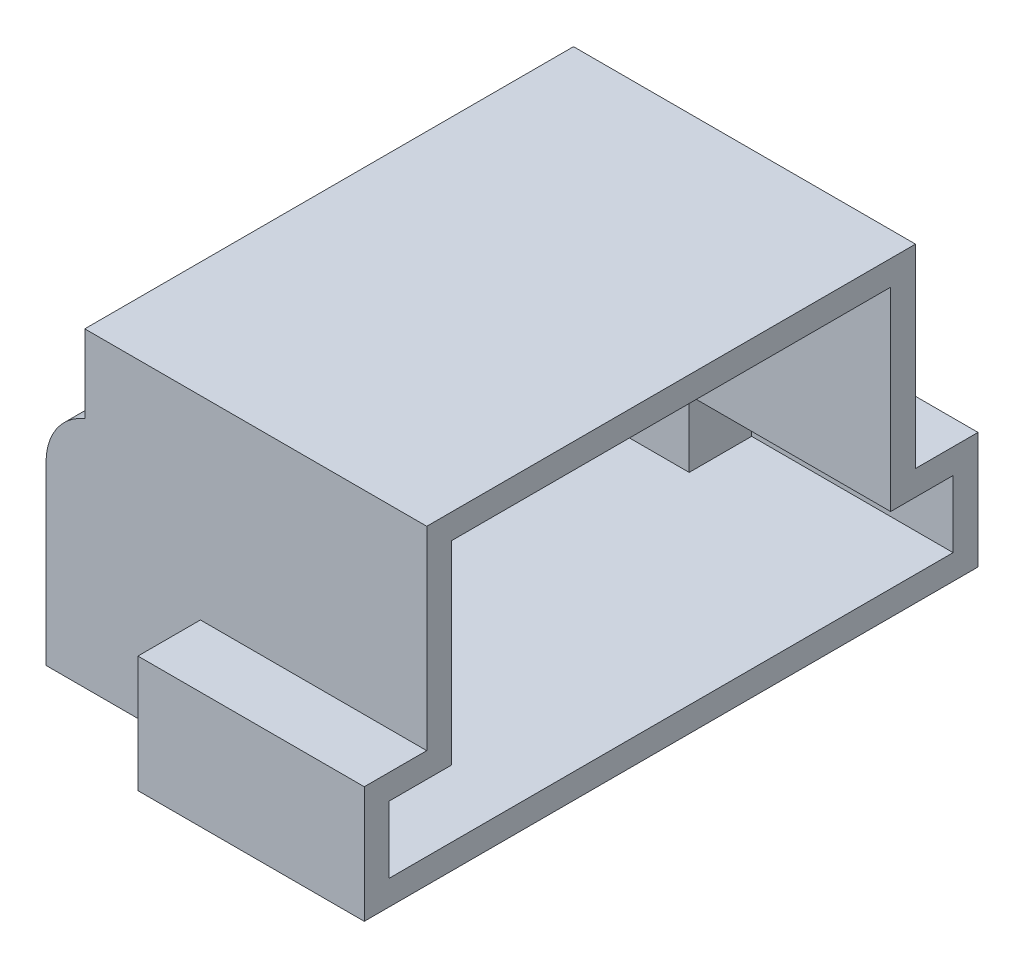
ISO-10303-21;
HEADER;
FILE_DESCRIPTION(('STEP AP214'),'2;1');
FILE_NAME('part.step','',(''),(''),'','','');
FILE_SCHEMA(('AUTOMOTIVE_DESIGN { 1 0 10303 214 1 1 1 1 }'));
ENDSEC;
DATA;
#1=APPLICATION_CONTEXT('core data for automotive mechanical design processes');
#2=APPLICATION_PROTOCOL_DEFINITION('international standard','automotive_design',2000,#1);
#3=PRODUCT_CONTEXT('',#1,'mechanical');
#4=PRODUCT('Part','Part','',(#3));
#5=PRODUCT_RELATED_PRODUCT_CATEGORY('part','',(#4));
#6=PRODUCT_DEFINITION_FORMATION('','',#4);
#7=PRODUCT_DEFINITION_CONTEXT('part definition',#1,'design');
#8=PRODUCT_DEFINITION('design','',#6,#7);
#9=PRODUCT_DEFINITION_SHAPE('','',#8);
#10=(LENGTH_UNIT() NAMED_UNIT(*) SI_UNIT(.MILLI.,.METRE.));
#11=(NAMED_UNIT(*) PLANE_ANGLE_UNIT() SI_UNIT($,.RADIAN.));
#12=(NAMED_UNIT(*) SI_UNIT($,.STERADIAN.) SOLID_ANGLE_UNIT());
#13=UNCERTAINTY_MEASURE_WITH_UNIT(LENGTH_MEASURE(1.E-05),#10,'distance_accuracy_value','');
#14=(GEOMETRIC_REPRESENTATION_CONTEXT(3) GLOBAL_UNCERTAINTY_ASSIGNED_CONTEXT((#13)) GLOBAL_UNIT_ASSIGNED_CONTEXT((#10,
#11,#12)) REPRESENTATION_CONTEXT('',''));
#15=CARTESIAN_POINT('',(0.,0.,0.));
#16=DIRECTION('',(0.,0.,1.));
#17=DIRECTION('',(1.,0.,0.));
#18=AXIS2_PLACEMENT_3D('',#15,#16,#17);
#19=CARTESIAN_POINT('',(4.6228,2.38125,0.));
#20=DIRECTION('',(-1.,0.,0.));
#21=DIRECTION('',(0.,0.,1.));
#22=AXIS2_PLACEMENT_3D('',#19,#20,#21);
#23=PLANE('',#22);
#24=DIRECTION('',(0.,0.,-1.));
#25=VECTOR('',#24,1.);
#26=CARTESIAN_POINT('',(4.6228,0.,0.));
#27=LINE('',#26,#25);
#28=CARTESIAN_POINT('',(4.6228,0.,0.));
#29=VERTEX_POINT('',#28);
#30=CARTESIAN_POINT('',(4.6228,0.,-12.5349));
#31=VERTEX_POINT('',#30);
#32=EDGE_CURVE('E428',#29,#31,#27,.T.);
#33=ORIENTED_EDGE('',*,*,#32,.T.);
#34=DIRECTION('',(0.,-1.,0.));
#35=VECTOR('',#34,1.);
#36=CARTESIAN_POINT('',(4.6228,2.38125,-12.5349));
#37=LINE('',#36,#35);
#38=CARTESIAN_POINT('',(4.6228,2.38125,-12.5349));
#39=VERTEX_POINT('',#38);
#40=EDGE_CURVE('E437',#39,#31,#37,.T.);
#41=ORIENTED_EDGE('',*,*,#40,.F.);
#42=DIRECTION('',(0.,0.,-1.));
#43=VECTOR('',#42,1.);
#44=CARTESIAN_POINT('',(4.6228,2.38125,0.));
#45=LINE('',#44,#43);
#46=CARTESIAN_POINT('',(4.6228,2.38125,-11.25855));
#47=VERTEX_POINT('',#46);
#48=EDGE_CURVE('E412',#47,#39,#45,.T.);
#49=ORIENTED_EDGE('',*,*,#48,.F.);
#50=DIRECTION('',(0.,-1.,0.));
#51=VECTOR('',#50,1.);
#52=CARTESIAN_POINT('',(4.6228,6.35,-11.25855));
#53=LINE('',#52,#51);
#54=CARTESIAN_POINT('',(4.6228,6.35,-11.25855));
#55=VERTEX_POINT('',#54);
#56=EDGE_CURVE('E373',#55,#47,#53,.T.);
#57=ORIENTED_EDGE('',*,*,#56,.F.);
#58=DIRECTION('',(0.,0.,1.));
#59=VECTOR('',#58,1.);
#60=CARTESIAN_POINT('',(4.6228,6.35,-6.26745));
#61=LINE('',#60,#59);
#62=CARTESIAN_POINT('',(4.6228,6.35,-1.27635));
#63=VERTEX_POINT('',#62);
#64=EDGE_CURVE('E345',#55,#63,#61,.T.);
#65=ORIENTED_EDGE('',*,*,#64,.T.);
#66=DIRECTION('',(0.,-1.,0.));
#67=VECTOR('',#66,1.);
#68=CARTESIAN_POINT('',(4.6228,6.35,-1.27635));
#69=LINE('',#68,#67);
#70=CARTESIAN_POINT('',(4.6228,2.38125,-1.27635));
#71=VERTEX_POINT('',#70);
#72=EDGE_CURVE('E362',#63,#71,#69,.T.);
#73=ORIENTED_EDGE('',*,*,#72,.T.);
#74=CARTESIAN_POINT('',(4.6228,2.38125,0.));
#75=VERTEX_POINT('',#74);
#76=EDGE_CURVE('E413',#75,#71,#45,.T.);
#77=ORIENTED_EDGE('',*,*,#76,.F.);
#78=DIRECTION('',(0.,-1.,0.));
#79=VECTOR('',#78,1.);
#80=CARTESIAN_POINT('',(4.6228,2.38125,0.));
#81=LINE('',#80,#79);
#82=EDGE_CURVE('E441',#75,#29,#81,.T.);
#83=ORIENTED_EDGE('',*,*,#82,.T.);
#84=EDGE_LOOP('',(#33,#41,#49,#57,#65,#73,#77,#83));
#85=FACE_BOUND('',#84,.T.);
#86=DIRECTION('',(0.,0.,-1.));
#87=VECTOR('',#86,1.);
#88=CARTESIAN_POINT('',(4.6228,0.508,0.));
#89=LINE('',#88,#87);
#90=CARTESIAN_POINT('',(4.6228,0.508,-0.508));
#91=VERTEX_POINT('',#90);
#92=CARTESIAN_POINT('',(4.6228,0.508,-12.0269));
#93=VERTEX_POINT('',#92);
#94=EDGE_CURVE('E278',#91,#93,#89,.T.);
#95=ORIENTED_EDGE('',*,*,#94,.F.);
#96=DIRECTION('',(0.,-1.,0.));
#97=VECTOR('',#96,1.);
#98=CARTESIAN_POINT('',(4.6228,2.38125,-0.508));
#99=LINE('',#98,#97);
#100=CARTESIAN_POINT('',(4.6228,1.87325,-0.508));
#101=VERTEX_POINT('',#100);
#102=EDGE_CURVE('E273',#101,#91,#99,.T.);
#103=ORIENTED_EDGE('',*,*,#102,.F.);
#104=DIRECTION('',(0.,0.,-1.));
#105=VECTOR('',#104,1.);
#106=CARTESIAN_POINT('',(4.6228,1.87325,0.));
#107=LINE('',#106,#105);
#108=CARTESIAN_POINT('',(4.6228,1.87325,-1.78435));
#109=VERTEX_POINT('',#108);
#110=EDGE_CURVE('E59',#101,#109,#107,.T.);
#111=ORIENTED_EDGE('',*,*,#110,.T.);
#112=DIRECTION('',(0.,-1.,0.));
#113=VECTOR('',#112,1.);
#114=CARTESIAN_POINT('',(4.6228,6.35,-1.78435));
#115=LINE('',#114,#113);
#116=CARTESIAN_POINT('',(4.6228,5.842,-1.78435));
#117=VERTEX_POINT('',#116);
#118=EDGE_CURVE('E231',#117,#109,#115,.T.);
#119=ORIENTED_EDGE('',*,*,#118,.F.);
#120=DIRECTION('',(0.,0.,1.));
#121=VECTOR('',#120,1.);
#122=CARTESIAN_POINT('',(4.6228,5.842,0.));
#123=LINE('',#122,#121);
#124=CARTESIAN_POINT('',(4.6228,5.842,-10.75055));
#125=VERTEX_POINT('',#124);
#126=EDGE_CURVE('E244',#125,#117,#123,.T.);
#127=ORIENTED_EDGE('',*,*,#126,.F.);
#128=DIRECTION('',(0.,-1.,0.));
#129=VECTOR('',#128,1.);
#130=CARTESIAN_POINT('',(4.6228,2.38125,-10.75055));
#131=LINE('',#130,#129);
#132=CARTESIAN_POINT('',(4.6228,1.87325,-10.75055));
#133=VERTEX_POINT('',#132);
#134=EDGE_CURVE('E262',#125,#133,#131,.T.);
#135=ORIENTED_EDGE('',*,*,#134,.T.);
#136=DIRECTION('',(0.,0.,-1.));
#137=VECTOR('',#136,1.);
#138=CARTESIAN_POINT('',(4.6228,1.87325,0.));
#139=LINE('',#138,#137);
#140=CARTESIAN_POINT('',(4.6228,1.87325,-12.0269));
#141=VERTEX_POINT('',#140);
#142=EDGE_CURVE('E277',#133,#141,#139,.T.);
#143=ORIENTED_EDGE('',*,*,#142,.T.);
#144=DIRECTION('',(0.,-1.,0.));
#145=VECTOR('',#144,1.);
#146=CARTESIAN_POINT('',(4.6228,2.38125,-12.0269));
#147=LINE('',#146,#145);
#148=EDGE_CURVE('E282',#141,#93,#147,.T.);
#149=ORIENTED_EDGE('',*,*,#148,.T.);
#150=EDGE_LOOP('',(#95,#103,#111,#119,#127,#135,#143,#149));
#151=FACE_BOUND('',#150,.T.);
#152=ADVANCED_FACE('F43',(#85,#151),#23,.F.);
#153=CARTESIAN_POINT('',(-2.3622,6.35,-1.27635));
#154=DIRECTION('',(-1.,0.,0.));
#155=DIRECTION('',(0.,0.,1.));
#156=AXIS2_PLACEMENT_3D('',#153,#154,#155);
#157=PLANE('',#156);
#158=DIRECTION('',(0.,0.,-1.));
#159=VECTOR('',#158,1.);
#160=CARTESIAN_POINT('',(-2.3622,4.7625,-10.4648));
#161=LINE('',#160,#159);
#162=CARTESIAN_POINT('',(-2.3622,4.7625,-10.4648));
#163=VERTEX_POINT('',#162);
#164=CARTESIAN_POINT('',(-2.3622,4.7625,-11.25855));
#165=VERTEX_POINT('',#164);
#166=EDGE_CURVE('E315',#163,#165,#161,.T.);
#167=ORIENTED_EDGE('',*,*,#166,.F.);
#168=DIRECTION('',(0.,-1.,0.));
#169=VECTOR('',#168,1.);
#170=CARTESIAN_POINT('',(-2.3622,0.,-10.4648));
#171=LINE('',#170,#169);
#172=CARTESIAN_POINT('',(-2.3622,0.,-10.4648));
#173=VERTEX_POINT('',#172);
#174=EDGE_CURVE('E301',#163,#173,#171,.T.);
#175=ORIENTED_EDGE('',*,*,#174,.T.);
#176=DIRECTION('',(0.,0.,-1.));
#177=VECTOR('',#176,1.);
#178=CARTESIAN_POINT('',(-2.3622,0.,-1.27635));
#179=LINE('',#178,#177);
#180=CARTESIAN_POINT('',(-2.3622,0.,-2.0701));
#181=VERTEX_POINT('',#180);
#182=EDGE_CURVE('E366',#181,#173,#179,.T.);
#183=ORIENTED_EDGE('',*,*,#182,.F.);
#184=DIRECTION('',(0.,1.,0.));
#185=VECTOR('',#184,1.);
#186=CARTESIAN_POINT('',(-2.3622,0.,-2.0701));
#187=LINE('',#186,#185);
#188=CARTESIAN_POINT('',(-2.3622,4.7625,-2.0701));
#189=VERTEX_POINT('',#188);
#190=EDGE_CURVE('E323',#181,#189,#187,.T.);
#191=ORIENTED_EDGE('',*,*,#190,.T.);
#192=DIRECTION('',(0.,0.,1.));
#193=VECTOR('',#192,1.);
#194=CARTESIAN_POINT('',(-2.3622,4.7625,-2.0701));
#195=LINE('',#194,#193);
#196=CARTESIAN_POINT('',(-2.3622,4.7625,-1.27635));
#197=VERTEX_POINT('',#196);
#198=EDGE_CURVE('E334',#189,#197,#195,.T.);
#199=ORIENTED_EDGE('',*,*,#198,.T.);
#200=DIRECTION('',(0.,-1.,0.));
#201=VECTOR('',#200,1.);
#202=CARTESIAN_POINT('',(-2.3622,6.35,-1.27635));
#203=LINE('',#202,#201);
#204=CARTESIAN_POINT('',(-2.3622,6.35,-1.27635));
#205=VERTEX_POINT('',#204);
#206=EDGE_CURVE('E381',#205,#197,#203,.T.);
#207=ORIENTED_EDGE('',*,*,#206,.F.);
#208=DIRECTION('',(0.,0.,-1.));
#209=VECTOR('',#208,1.);
#210=CARTESIAN_POINT('',(-2.3622,6.35,-1.27635));
#211=LINE('',#210,#209);
#212=CARTESIAN_POINT('',(-2.3622,6.35,-11.25855));
#213=VERTEX_POINT('',#212);
#214=EDGE_CURVE('E354',#205,#213,#211,.T.);
#215=ORIENTED_EDGE('',*,*,#214,.T.);
#216=DIRECTION('',(0.,-1.,0.));
#217=VECTOR('',#216,1.);
#218=CARTESIAN_POINT('',(-2.3622,6.35,-11.25855));
#219=LINE('',#218,#217);
#220=EDGE_CURVE('E377',#213,#165,#219,.T.);
#221=ORIENTED_EDGE('',*,*,#220,.T.);
#222=EDGE_LOOP('',(#167,#175,#183,#191,#199,#207,#215,#221));
#223=FACE_BOUND('',#222,.T.);
#224=ADVANCED_FACE('F469',(#223),#157,.T.);
#225=CARTESIAN_POINT('',(0.,2.38125,0.));
#226=DIRECTION('',(1.,0.,0.));
#227=DIRECTION('',(0.,0.,-1.));
#228=AXIS2_PLACEMENT_3D('',#225,#226,#227);
#229=PLANE('',#228);
#230=DIRECTION('',(0.,0.,1.));
#231=VECTOR('',#230,1.);
#232=CARTESIAN_POINT('',(0.,0.,0.));
#233=LINE('',#232,#231);
#234=CARTESIAN_POINT('',(0.,0.,-12.5349));
#235=VERTEX_POINT('',#234);
#236=CARTESIAN_POINT('',(0.,0.,-11.25855));
#237=VERTEX_POINT('',#236);
#238=EDGE_CURVE('E421',#235,#237,#233,.T.);
#239=ORIENTED_EDGE('',*,*,#238,.T.);
#240=DIRECTION('',(0.,1.,0.));
#241=VECTOR('',#240,1.);
#242=CARTESIAN_POINT('',(0.,2.38125,-11.25855));
#243=LINE('',#242,#241);
#244=CARTESIAN_POINT('',(0.,2.38125,-11.25855));
#245=VERTEX_POINT('',#244);
#246=EDGE_CURVE('E399',#237,#245,#243,.T.);
#247=ORIENTED_EDGE('',*,*,#246,.T.);
#248=DIRECTION('',(0.,0.,1.));
#249=VECTOR('',#248,1.);
#250=CARTESIAN_POINT('',(0.,2.38125,0.));
#251=LINE('',#250,#249);
#252=CARTESIAN_POINT('',(0.,2.38125,-12.5349));
#253=VERTEX_POINT('',#252);
#254=EDGE_CURVE('E404',#253,#245,#251,.T.);
#255=ORIENTED_EDGE('',*,*,#254,.F.);
#256=DIRECTION('',(0.,-1.,0.));
#257=VECTOR('',#256,1.);
#258=CARTESIAN_POINT('',(0.,2.38125,-12.5349));
#259=LINE('',#258,#257);
#260=EDGE_CURVE('E420',#253,#235,#259,.T.);
#261=ORIENTED_EDGE('',*,*,#260,.T.);
#262=EDGE_LOOP('',(#239,#247,#255,#261));
#263=FACE_BOUND('',#262,.T.);
#264=ADVANCED_FACE('F509',(#263),#229,.F.);
#265=CARTESIAN_POINT('',(0.,2.38125,0.));
#266=DIRECTION('',(0.,-1.,0.));
#267=DIRECTION('',(0.,0.,-1.));
#268=AXIS2_PLACEMENT_3D('',#265,#266,#267);
#269=PLANE('',#268);
#270=ORIENTED_EDGE('',*,*,#254,.T.);
#271=DIRECTION('',(1.,0.,0.));
#272=VECTOR('',#271,1.);
#273=CARTESIAN_POINT('',(0.,2.38125,-11.25855));
#274=LINE('',#273,#272);
#275=EDGE_CURVE('E395',#245,#47,#274,.T.);
#276=ORIENTED_EDGE('',*,*,#275,.T.);
#277=ORIENTED_EDGE('',*,*,#48,.T.);
#278=DIRECTION('',(-1.,0.,0.));
#279=VECTOR('',#278,1.);
#280=CARTESIAN_POINT('',(0.,2.38125,-12.5349));
#281=LINE('',#280,#279);
#282=EDGE_CURVE('E417',#39,#253,#281,.T.);
#283=ORIENTED_EDGE('',*,*,#282,.T.);
#284=EDGE_LOOP('',(#270,#276,#277,#283));
#285=FACE_BOUND('',#284,.T.);
#286=ADVANCED_FACE('F522',(#285),#269,.F.);
#287=CARTESIAN_POINT('',(0.,2.38125,-1.27635));
#288=VERTEX_POINT('',#287);
#289=CARTESIAN_POINT('',(0.,2.38125,0.));
#290=VERTEX_POINT('',#289);
#291=EDGE_CURVE('E409',#288,#290,#251,.T.);
#292=ORIENTED_EDGE('',*,*,#291,.F.);
#293=DIRECTION('',(0.,-1.,0.));
#294=VECTOR('',#293,1.);
#295=CARTESIAN_POINT('',(0.,2.38125,-1.27635));
#296=LINE('',#295,#294);
#297=CARTESIAN_POINT('',(0.,0.,-1.27635));
#298=VERTEX_POINT('',#297);
#299=EDGE_CURVE('E391',#288,#298,#296,.T.);
#300=ORIENTED_EDGE('',*,*,#299,.T.);
#301=CARTESIAN_POINT('',(0.,0.,0.));
#302=VERTEX_POINT('',#301);
#303=EDGE_CURVE('E403',#298,#302,#233,.T.);
#304=ORIENTED_EDGE('',*,*,#303,.T.);
#305=DIRECTION('',(0.,-1.,0.));
#306=VECTOR('',#305,1.);
#307=CARTESIAN_POINT('',(0.,2.38125,0.));
#308=LINE('',#307,#306);
#309=EDGE_CURVE('E445',#290,#302,#308,.T.);
#310=ORIENTED_EDGE('',*,*,#309,.F.);
#311=EDGE_LOOP('',(#292,#300,#304,#310));
#312=FACE_BOUND('',#311,.T.);
#313=ADVANCED_FACE('F519',(#312),#229,.F.);
#314=CARTESIAN_POINT('',(0.,2.38125,0.));
#315=DIRECTION('',(0.,0.,-1.));
#316=DIRECTION('',(-1.,0.,0.));
#317=AXIS2_PLACEMENT_3D('',#314,#315,#316);
#318=PLANE('',#317);
#319=DIRECTION('',(1.,0.,0.));
#320=VECTOR('',#319,1.);
#321=CARTESIAN_POINT('',(0.,0.,0.));
#322=LINE('',#321,#320);
#323=EDGE_CURVE('E425',#302,#29,#322,.T.);
#324=ORIENTED_EDGE('',*,*,#323,.T.);
#325=ORIENTED_EDGE('',*,*,#82,.F.);
#326=DIRECTION('',(1.,0.,0.));
#327=VECTOR('',#326,1.);
#328=CARTESIAN_POINT('',(0.,2.38125,0.));
#329=LINE('',#328,#327);
#330=EDGE_CURVE('E408',#290,#75,#329,.T.);
#331=ORIENTED_EDGE('',*,*,#330,.F.);
#332=ORIENTED_EDGE('',*,*,#309,.T.);
#333=EDGE_LOOP('',(#324,#325,#331,#332));
#334=FACE_BOUND('',#333,.T.);
#335=ADVANCED_FACE('F516',(#334),#318,.F.);
#336=CARTESIAN_POINT('',(0.,2.38125,-12.5349));
#337=DIRECTION('',(0.,0.,1.));
#338=DIRECTION('',(1.,0.,0.));
#339=AXIS2_PLACEMENT_3D('',#336,#337,#338);
#340=PLANE('',#339);
#341=DIRECTION('',(-1.,0.,0.));
#342=VECTOR('',#341,1.);
#343=CARTESIAN_POINT('',(0.,0.,-12.5349));
#344=LINE('',#343,#342);
#345=EDGE_CURVE('E431',#31,#235,#344,.T.);
#346=ORIENTED_EDGE('',*,*,#345,.T.);
#347=ORIENTED_EDGE('',*,*,#260,.F.);
#348=ORIENTED_EDGE('',*,*,#282,.F.);
#349=ORIENTED_EDGE('',*,*,#40,.T.);
#350=EDGE_LOOP('',(#346,#347,#348,#349));
#351=FACE_BOUND('',#350,.T.);
#352=ADVANCED_FACE('F514',(#351),#340,.F.);
#353=ORIENTED_EDGE('',*,*,#76,.T.);
#354=DIRECTION('',(-1.,0.,0.));
#355=VECTOR('',#354,1.);
#356=CARTESIAN_POINT('',(0.,2.38125,-1.27635));
#357=LINE('',#356,#355);
#358=EDGE_CURVE('E376',#71,#288,#357,.T.);
#359=ORIENTED_EDGE('',*,*,#358,.T.);
#360=ORIENTED_EDGE('',*,*,#291,.T.);
#361=ORIENTED_EDGE('',*,*,#330,.T.);
#362=EDGE_LOOP('',(#353,#359,#360,#361));
#363=FACE_BOUND('',#362,.T.);
#364=ADVANCED_FACE('F769',(#363),#269,.F.);
#365=CARTESIAN_POINT('',(0.,0.,0.));
#366=DIRECTION('',(0.,-1.,0.));
#367=DIRECTION('',(0.,0.,-1.));
#368=AXIS2_PLACEMENT_3D('',#365,#366,#367);
#369=PLANE('',#368);
#370=ORIENTED_EDGE('',*,*,#303,.F.);
#371=DIRECTION('',(-1.,0.,0.));
#372=VECTOR('',#371,1.);
#373=CARTESIAN_POINT('',(4.6228,0.,-1.27635));
#374=LINE('',#373,#372);
#375=CARTESIAN_POINT('',(-3.15396144115094,0.,-1.27635));
#376=VERTEX_POINT('',#375);
#377=EDGE_CURVE('E341',#298,#376,#374,.T.);
#378=ORIENTED_EDGE('',*,*,#377,.T.);
#379=DIRECTION('',(0.,0.,1.));
#380=VECTOR('',#379,1.);
#381=CARTESIAN_POINT('',(-3.15396144115094,0.,-2.0701));
#382=LINE('',#381,#380);
#383=CARTESIAN_POINT('',(-3.15396144115094,0.,-2.0701));
#384=VERTEX_POINT('',#383);
#385=EDGE_CURVE('E337',#384,#376,#382,.T.);
#386=ORIENTED_EDGE('',*,*,#385,.F.);
#387=DIRECTION('',(1.,0.,0.));
#388=VECTOR('',#387,1.);
#389=CARTESIAN_POINT('',(-2.3622,0.,-2.0701));
#390=LINE('',#389,#388);
#391=EDGE_CURVE('E330',#384,#181,#390,.T.);
#392=ORIENTED_EDGE('',*,*,#391,.T.);
#393=ORIENTED_EDGE('',*,*,#182,.T.);
#394=DIRECTION('',(-1.,0.,0.));
#395=VECTOR('',#394,1.);
#396=CARTESIAN_POINT('',(-2.3622,0.,-10.4648));
#397=LINE('',#396,#395);
#398=CARTESIAN_POINT('',(-3.15396144115094,0.,-10.4648));
#399=VERTEX_POINT('',#398);
#400=EDGE_CURVE('E304',#173,#399,#397,.T.);
#401=ORIENTED_EDGE('',*,*,#400,.T.);
#402=DIRECTION('',(0.,0.,-1.));
#403=VECTOR('',#402,1.);
#404=CARTESIAN_POINT('',(-3.15396144115094,0.,-10.4648));
#405=LINE('',#404,#403);
#406=CARTESIAN_POINT('',(-3.15396144115094,0.,-11.25855));
#407=VERTEX_POINT('',#406);
#408=EDGE_CURVE('E311',#399,#407,#405,.T.);
#409=ORIENTED_EDGE('',*,*,#408,.T.);
#410=DIRECTION('',(1.,0.,0.));
#411=VECTOR('',#410,1.);
#412=CARTESIAN_POINT('',(4.6228,0.,-11.25855));
#413=LINE('',#412,#411);
#414=EDGE_CURVE('E350',#407,#237,#413,.T.);
#415=ORIENTED_EDGE('',*,*,#414,.T.);
#416=ORIENTED_EDGE('',*,*,#238,.F.);
#417=ORIENTED_EDGE('',*,*,#345,.F.);
#418=ORIENTED_EDGE('',*,*,#32,.F.);
#419=ORIENTED_EDGE('',*,*,#323,.F.);
#420=EDGE_LOOP('',(#370,#378,#386,#392,#393,#401,#409,#415,#416,#417,#418,#419));
#421=FACE_BOUND('',#420,.T.);
#422=ADVANCED_FACE('F477',(#421),#369,.T.);
#423=CARTESIAN_POINT('',(4.6228,6.35,-11.25855));
#424=DIRECTION('',(0.,0.,-1.));
#425=DIRECTION('',(-1.,0.,0.));
#426=AXIS2_PLACEMENT_3D('',#423,#424,#425);
#427=PLANE('',#426);
#428=DIRECTION('',(0.,1.,0.));
#429=VECTOR('',#428,1.);
#430=CARTESIAN_POINT('',(-3.15396144115094,0.,-11.25855));
#431=LINE('',#430,#429);
#432=CARTESIAN_POINT('',(-3.15396144115094,3.58598485737328,-11.25855));
#433=VERTEX_POINT('',#432);
#434=EDGE_CURVE('E272',#407,#433,#431,.T.);
#435=ORIENTED_EDGE('',*,*,#434,.T.);
#436=CARTESIAN_POINT('',(-1.88396144115094,3.58598485737328,-11.25855));
#437=DIRECTION('',(0.,0.,-1.));
#438=DIRECTION('',(-1.,0.,0.));
#439=AXIS2_PLACEMENT_3D('',#436,#437,#438);
#440=CIRCLE('',#439,1.27);
#441=EDGE_CURVE('E52',#433,#165,#440,.T.);
#442=ORIENTED_EDGE('',*,*,#441,.T.);
#443=ORIENTED_EDGE('',*,*,#220,.F.);
#444=DIRECTION('',(1.,0.,0.));
#445=VECTOR('',#444,1.);
#446=CARTESIAN_POINT('',(4.6228,6.35,-11.25855));
#447=LINE('',#446,#445);
#448=EDGE_CURVE('E358',#213,#55,#447,.T.);
#449=ORIENTED_EDGE('',*,*,#448,.T.);
#450=ORIENTED_EDGE('',*,*,#56,.T.);
#451=ORIENTED_EDGE('',*,*,#275,.F.);
#452=ORIENTED_EDGE('',*,*,#246,.F.);
#453=ORIENTED_EDGE('',*,*,#414,.F.);
#454=EDGE_LOOP('',(#435,#442,#443,#449,#450,#451,#452,#453));
#455=FACE_BOUND('',#454,.T.);
#456=ADVANCED_FACE('F463',(#455),#427,.T.);
#457=CARTESIAN_POINT('',(4.6228,6.35,-1.27635));
#458=DIRECTION('',(0.,0.,1.));
#459=DIRECTION('',(1.,0.,0.));
#460=AXIS2_PLACEMENT_3D('',#457,#458,#459);
#461=PLANE('',#460);
#462=ORIENTED_EDGE('',*,*,#206,.T.);
#463=CARTESIAN_POINT('',(-1.88396144115094,3.58598485737328,-1.27635));
#464=DIRECTION('',(0.,0.,1.));
#465=DIRECTION('',(1.,0.,0.));
#466=AXIS2_PLACEMENT_3D('',#463,#464,#465);
#467=CIRCLE('',#466,1.27);
#468=CARTESIAN_POINT('',(-3.15396144115094,3.58598485737328,-1.27635));
#469=VERTEX_POINT('',#468);
#470=EDGE_CURVE('E449',#197,#469,#467,.T.);
#471=ORIENTED_EDGE('',*,*,#470,.T.);
#472=DIRECTION('',(0.,-1.,0.));
#473=VECTOR('',#472,1.);
#474=CARTESIAN_POINT('',(-3.15396144115094,0.,-1.27635));
#475=LINE('',#474,#473);
#476=EDGE_CURVE('E319',#469,#376,#475,.T.);
#477=ORIENTED_EDGE('',*,*,#476,.T.);
#478=ORIENTED_EDGE('',*,*,#377,.F.);
#479=ORIENTED_EDGE('',*,*,#299,.F.);
#480=ORIENTED_EDGE('',*,*,#358,.F.);
#481=ORIENTED_EDGE('',*,*,#72,.F.);
#482=DIRECTION('',(-1.,0.,0.));
#483=VECTOR('',#482,1.);
#484=CARTESIAN_POINT('',(4.6228,6.35,-1.27635));
#485=LINE('',#484,#483);
#486=EDGE_CURVE('E349',#63,#205,#485,.T.);
#487=ORIENTED_EDGE('',*,*,#486,.T.);
#488=EDGE_LOOP('',(#462,#471,#477,#478,#479,#480,#481,#487));
#489=FACE_BOUND('',#488,.T.);
#490=ADVANCED_FACE('F489',(#489),#461,.T.);
#491=CARTESIAN_POINT('',(0.,6.35,0.));
#492=DIRECTION('',(0.,-1.,0.));
#493=DIRECTION('',(0.,0.,-1.));
#494=AXIS2_PLACEMENT_3D('',#491,#492,#493);
#495=PLANE('',#494);
#496=ORIENTED_EDGE('',*,*,#64,.F.);
#497=ORIENTED_EDGE('',*,*,#448,.F.);
#498=ORIENTED_EDGE('',*,*,#214,.F.);
#499=ORIENTED_EDGE('',*,*,#486,.F.);
#500=EDGE_LOOP('',(#496,#497,#498,#499));
#501=FACE_BOUND('',#500,.T.);
#502=ADVANCED_FACE('F501',(#501),#495,.F.);
#503=CARTESIAN_POINT('',(-3.15396144115094,0.,-2.0701));
#504=DIRECTION('',(-1.,0.,0.));
#505=DIRECTION('',(0.,0.,1.));
#506=AXIS2_PLACEMENT_3D('',#503,#504,#505);
#507=PLANE('',#506);
#508=ORIENTED_EDGE('',*,*,#476,.F.);
#509=DIRECTION('',(0.,0.,-1.));
#510=VECTOR('',#509,1.);
#511=CARTESIAN_POINT('',(-3.15396144115094,3.58598485737328,-2.0701));
#512=LINE('',#511,#510);
#513=CARTESIAN_POINT('',(-3.15396144115094,3.58598485737328,-2.0701));
#514=VERTEX_POINT('',#513);
#515=EDGE_CURVE('E452',#469,#514,#512,.T.);
#516=ORIENTED_EDGE('',*,*,#515,.T.);
#517=DIRECTION('',(0.,-1.,0.));
#518=VECTOR('',#517,1.);
#519=CARTESIAN_POINT('',(-3.15396144115094,0.,-2.0701));
#520=LINE('',#519,#518);
#521=EDGE_CURVE('E327',#514,#384,#520,.T.);
#522=ORIENTED_EDGE('',*,*,#521,.T.);
#523=ORIENTED_EDGE('',*,*,#385,.T.);
#524=EDGE_LOOP('',(#508,#516,#522,#523));
#525=FACE_BOUND('',#524,.T.);
#526=ADVANCED_FACE('F491',(#525),#507,.T.);
#527=CARTESIAN_POINT('',(0.,0.,-2.0701));
#528=DIRECTION('',(0.,0.,1.));
#529=DIRECTION('',(1.,0.,0.));
#530=AXIS2_PLACEMENT_3D('',#527,#528,#529);
#531=PLANE('',#530);
#532=ORIENTED_EDGE('',*,*,#521,.F.);
#533=CARTESIAN_POINT('',(-1.88396144115094,3.58598485737328,-2.0701));
#534=DIRECTION('',(0.,0.,1.));
#535=DIRECTION('',(1.,0.,0.));
#536=AXIS2_PLACEMENT_3D('',#533,#534,#535);
#537=CIRCLE('',#536,1.27);
#538=EDGE_CURVE('E455',#514,#189,#537,.F.);
#539=ORIENTED_EDGE('',*,*,#538,.T.);
#540=ORIENTED_EDGE('',*,*,#190,.F.);
#541=ORIENTED_EDGE('',*,*,#391,.F.);
#542=EDGE_LOOP('',(#532,#539,#540,#541));
#543=FACE_BOUND('',#542,.T.);
#544=ADVANCED_FACE('F493',(#543),#531,.F.);
#545=CARTESIAN_POINT('',(-3.15396144115094,0.,-10.4648));
#546=DIRECTION('',(-1.,0.,0.));
#547=DIRECTION('',(0.,0.,1.));
#548=AXIS2_PLACEMENT_3D('',#545,#546,#547);
#549=PLANE('',#548);
#550=DIRECTION('',(0.,1.,0.));
#551=VECTOR('',#550,1.);
#552=CARTESIAN_POINT('',(-3.15396144115094,0.,-10.4648));
#553=LINE('',#552,#551);
#554=CARTESIAN_POINT('',(-3.15396144115094,3.58598485737328,-10.4648));
#555=VERTEX_POINT('',#554);
#556=EDGE_CURVE('E308',#399,#555,#553,.T.);
#557=ORIENTED_EDGE('',*,*,#556,.T.);
#558=DIRECTION('',(0.,0.,-1.));
#559=VECTOR('',#558,1.);
#560=CARTESIAN_POINT('',(-3.15396144115094,3.58598485737328,-11.25855));
#561=LINE('',#560,#559);
#562=EDGE_CURVE('E458',#555,#433,#561,.T.);
#563=ORIENTED_EDGE('',*,*,#562,.T.);
#564=ORIENTED_EDGE('',*,*,#434,.F.);
#565=ORIENTED_EDGE('',*,*,#408,.F.);
#566=EDGE_LOOP('',(#557,#563,#564,#565));
#567=FACE_BOUND('',#566,.T.);
#568=ADVANCED_FACE('F472',(#567),#549,.T.);
#569=CARTESIAN_POINT('',(0.,0.,-10.4648));
#570=DIRECTION('',(0.,0.,1.));
#571=DIRECTION('',(1.,0.,0.));
#572=AXIS2_PLACEMENT_3D('',#569,#570,#571);
#573=PLANE('',#572);
#574=ORIENTED_EDGE('',*,*,#174,.F.);
#575=CARTESIAN_POINT('',(-1.88396144115094,3.58598485737328,-10.4648));
#576=DIRECTION('',(0.,0.,1.));
#577=DIRECTION('',(1.,0.,0.));
#578=AXIS2_PLACEMENT_3D('',#575,#576,#577);
#579=CIRCLE('',#578,1.27);
#580=EDGE_CURVE('E11',#163,#555,#579,.T.);
#581=ORIENTED_EDGE('',*,*,#580,.T.);
#582=ORIENTED_EDGE('',*,*,#556,.F.);
#583=ORIENTED_EDGE('',*,*,#400,.F.);
#584=EDGE_LOOP('',(#574,#581,#582,#583));
#585=FACE_BOUND('',#584,.T.);
#586=ADVANCED_FACE('F474',(#585),#573,.T.);
#587=CARTESIAN_POINT('',(-1.88396144115094,3.58598485737328,-2.0701));
#588=DIRECTION('',(0.,0.,1.));
#589=DIRECTION('',(1.,0.,0.));
#590=AXIS2_PLACEMENT_3D('',#587,#588,#589);
#591=CYLINDRICAL_SURFACE('',#590,1.27);
#592=ORIENTED_EDGE('',*,*,#538,.F.);
#593=ORIENTED_EDGE('',*,*,#515,.F.);
#594=ORIENTED_EDGE('',*,*,#470,.F.);
#595=ORIENTED_EDGE('',*,*,#198,.F.);
#596=EDGE_LOOP('',(#592,#593,#594,#595));
#597=FACE_BOUND('',#596,.T.);
#598=ADVANCED_FACE('F485',(#597),#591,.T.);
#599=CARTESIAN_POINT('',(-1.88396144115094,3.58598485737328,-10.4648));
#600=DIRECTION('',(0.,0.,1.));
#601=DIRECTION('',(1.,0.,0.));
#602=AXIS2_PLACEMENT_3D('',#599,#600,#601);
#603=CYLINDRICAL_SURFACE('',#602,1.27);
#604=ORIENTED_EDGE('',*,*,#580,.F.);
#605=ORIENTED_EDGE('',*,*,#166,.T.);
#606=ORIENTED_EDGE('',*,*,#441,.F.);
#607=ORIENTED_EDGE('',*,*,#562,.F.);
#608=EDGE_LOOP('',(#604,#605,#606,#607));
#609=FACE_BOUND('',#608,.T.);
#610=ADVANCED_FACE('F45',(#609),#603,.T.);
#611=CARTESIAN_POINT('',(-1.8542,6.35,-1.27635));
#612=DIRECTION('',(-1.,0.,0.));
#613=DIRECTION('',(0.,0.,1.));
#614=AXIS2_PLACEMENT_3D('',#611,#612,#613);
#615=PLANE('',#614);
#616=DIRECTION('',(0.,-1.,0.));
#617=VECTOR('',#616,1.);
#618=CARTESIAN_POINT('',(-1.8542,6.35,-10.75055));
#619=LINE('',#618,#617);
#620=CARTESIAN_POINT('',(-1.8542,5.842,-10.75055));
#621=VERTEX_POINT('',#620);
#622=CARTESIAN_POINT('',(-1.8542,0.508,-10.75055));
#623=VERTEX_POINT('',#622);
#624=EDGE_CURVE('E230',#621,#623,#619,.T.);
#625=ORIENTED_EDGE('',*,*,#624,.F.);
#626=DIRECTION('',(0.,0.,-1.));
#627=VECTOR('',#626,1.);
#628=CARTESIAN_POINT('',(-1.8542,5.842,0.));
#629=LINE('',#628,#627);
#630=CARTESIAN_POINT('',(-1.8542,5.842,-1.78435));
#631=VERTEX_POINT('',#630);
#632=EDGE_CURVE('E234',#631,#621,#629,.T.);
#633=ORIENTED_EDGE('',*,*,#632,.F.);
#634=DIRECTION('',(0.,-1.,0.));
#635=VECTOR('',#634,1.);
#636=CARTESIAN_POINT('',(-1.8542,6.35,-1.78435));
#637=LINE('',#636,#635);
#638=CARTESIAN_POINT('',(-1.8542,0.508,-1.78435));
#639=VERTEX_POINT('',#638);
#640=EDGE_CURVE('E217',#631,#639,#637,.T.);
#641=ORIENTED_EDGE('',*,*,#640,.T.);
#642=DIRECTION('',(0.,0.,-1.));
#643=VECTOR('',#642,1.);
#644=CARTESIAN_POINT('',(-1.8542,0.508,0.));
#645=LINE('',#644,#643);
#646=EDGE_CURVE('E900',#639,#623,#645,.T.);
#647=ORIENTED_EDGE('',*,*,#646,.T.);
#648=EDGE_LOOP('',(#625,#633,#641,#647));
#649=FACE_BOUND('',#648,.T.);
#650=ADVANCED_FACE('F235',(#649),#615,.F.);
#651=CARTESIAN_POINT('',(0.508,2.38125,0.));
#652=DIRECTION('',(1.,0.,0.));
#653=DIRECTION('',(0.,0.,-1.));
#654=AXIS2_PLACEMENT_3D('',#651,#652,#653);
#655=PLANE('',#654);
#656=DIRECTION('',(0.,0.,1.));
#657=VECTOR('',#656,1.);
#658=CARTESIAN_POINT('',(0.508,0.508,0.));
#659=LINE('',#658,#657);
#660=CARTESIAN_POINT('',(0.508,0.508,-12.0269));
#661=VERTEX_POINT('',#660);
#662=CARTESIAN_POINT('',(0.508,0.508,-10.75055));
#663=VERTEX_POINT('',#662);
#664=EDGE_CURVE('E871',#661,#663,#659,.T.);
#665=ORIENTED_EDGE('',*,*,#664,.F.);
#666=DIRECTION('',(0.,-1.,0.));
#667=VECTOR('',#666,1.);
#668=CARTESIAN_POINT('',(0.508,2.38125,-12.0269));
#669=LINE('',#668,#667);
#670=CARTESIAN_POINT('',(0.508,1.87325,-12.0269));
#671=VERTEX_POINT('',#670);
#672=EDGE_CURVE('E286',#671,#661,#669,.T.);
#673=ORIENTED_EDGE('',*,*,#672,.F.);
#674=DIRECTION('',(0.,0.,1.));
#675=VECTOR('',#674,1.);
#676=CARTESIAN_POINT('',(0.508,1.87325,0.));
#677=LINE('',#676,#675);
#678=CARTESIAN_POINT('',(0.508,1.87325,-10.75055));
#679=VERTEX_POINT('',#678);
#680=EDGE_CURVE('E266',#671,#679,#677,.T.);
#681=ORIENTED_EDGE('',*,*,#680,.T.);
#682=DIRECTION('',(0.,1.,0.));
#683=VECTOR('',#682,1.);
#684=CARTESIAN_POINT('',(0.508,2.38125,-10.75055));
#685=LINE('',#684,#683);
#686=EDGE_CURVE('E878',#663,#679,#685,.T.);
#687=ORIENTED_EDGE('',*,*,#686,.F.);
#688=EDGE_LOOP('',(#665,#673,#681,#687));
#689=FACE_BOUND('',#688,.T.);
#690=ADVANCED_FACE('F558',(#689),#655,.T.);
#691=CARTESIAN_POINT('',(0.,1.87325,0.));
#692=DIRECTION('',(0.,-1.,0.));
#693=DIRECTION('',(0.,0.,-1.));
#694=AXIS2_PLACEMENT_3D('',#691,#692,#693);
#695=PLANE('',#694);
#696=ORIENTED_EDGE('',*,*,#680,.F.);
#697=DIRECTION('',(-1.,0.,0.));
#698=VECTOR('',#697,1.);
#699=CARTESIAN_POINT('',(0.,1.87325,-12.0269));
#700=LINE('',#699,#698);
#701=EDGE_CURVE('E297',#141,#671,#700,.T.);
#702=ORIENTED_EDGE('',*,*,#701,.F.);
#703=ORIENTED_EDGE('',*,*,#142,.F.);
#704=DIRECTION('',(1.,0.,0.));
#705=VECTOR('',#704,1.);
#706=CARTESIAN_POINT('',(0.,1.87325,-10.75055));
#707=LINE('',#706,#705);
#708=EDGE_CURVE('E257',#679,#133,#707,.T.);
#709=ORIENTED_EDGE('',*,*,#708,.F.);
#710=EDGE_LOOP('',(#696,#702,#703,#709));
#711=FACE_BOUND('',#710,.T.);
#712=ADVANCED_FACE('F555',(#711),#695,.T.);
#713=DIRECTION('',(0.,0.,1.));
#714=VECTOR('',#713,1.);
#715=CARTESIAN_POINT('',(0.508,1.87325,0.));
#716=LINE('',#715,#714);
#717=CARTESIAN_POINT('',(0.508,1.87325,-1.78435));
#718=VERTEX_POINT('',#717);
#719=CARTESIAN_POINT('',(0.508,1.87325,-0.508));
#720=VERTEX_POINT('',#719);
#721=EDGE_CURVE('E263',#718,#720,#716,.T.);
#722=ORIENTED_EDGE('',*,*,#721,.T.);
#723=DIRECTION('',(0.,-1.,0.));
#724=VECTOR('',#723,1.);
#725=CARTESIAN_POINT('',(0.508,2.38125,-0.508));
#726=LINE('',#725,#724);
#727=CARTESIAN_POINT('',(0.508,0.508,-0.508));
#728=VERTEX_POINT('',#727);
#729=EDGE_CURVE('E268',#720,#728,#726,.T.);
#730=ORIENTED_EDGE('',*,*,#729,.T.);
#731=DIRECTION('',(0.,0.,1.));
#732=VECTOR('',#731,1.);
#733=CARTESIAN_POINT('',(0.508,0.508,0.));
#734=LINE('',#733,#732);
#735=CARTESIAN_POINT('',(0.508,0.508,-1.78435));
#736=VERTEX_POINT('',#735);
#737=EDGE_CURVE('E875',#736,#728,#734,.T.);
#738=ORIENTED_EDGE('',*,*,#737,.F.);
#739=DIRECTION('',(0.,-1.,0.));
#740=VECTOR('',#739,1.);
#741=CARTESIAN_POINT('',(0.508,2.38125,-1.78435));
#742=LINE('',#741,#740);
#743=EDGE_CURVE('E254',#718,#736,#742,.T.);
#744=ORIENTED_EDGE('',*,*,#743,.F.);
#745=EDGE_LOOP('',(#722,#730,#738,#744));
#746=FACE_BOUND('',#745,.T.);
#747=ADVANCED_FACE('F553',(#746),#655,.T.);
#748=CARTESIAN_POINT('',(0.,2.38125,-0.508));
#749=DIRECTION('',(0.,0.,-1.));
#750=DIRECTION('',(-1.,0.,0.));
#751=AXIS2_PLACEMENT_3D('',#748,#749,#750);
#752=PLANE('',#751);
#753=DIRECTION('',(1.,0.,0.));
#754=VECTOR('',#753,1.);
#755=CARTESIAN_POINT('',(0.,0.508,-0.508));
#756=LINE('',#755,#754);
#757=EDGE_CURVE('E281',#728,#91,#756,.T.);
#758=ORIENTED_EDGE('',*,*,#757,.F.);
#759=ORIENTED_EDGE('',*,*,#729,.F.);
#760=DIRECTION('',(1.,0.,0.));
#761=VECTOR('',#760,1.);
#762=CARTESIAN_POINT('',(0.,1.87325,-0.508));
#763=LINE('',#762,#761);
#764=EDGE_CURVE('E274',#720,#101,#763,.T.);
#765=ORIENTED_EDGE('',*,*,#764,.T.);
#766=ORIENTED_EDGE('',*,*,#102,.T.);
#767=EDGE_LOOP('',(#758,#759,#765,#766));
#768=FACE_BOUND('',#767,.T.);
#769=ADVANCED_FACE('F549',(#768),#752,.T.);
#770=CARTESIAN_POINT('',(0.,2.38125,-12.0269));
#771=DIRECTION('',(0.,0.,1.));
#772=DIRECTION('',(1.,0.,0.));
#773=AXIS2_PLACEMENT_3D('',#770,#771,#772);
#774=PLANE('',#773);
#775=DIRECTION('',(-1.,0.,0.));
#776=VECTOR('',#775,1.);
#777=CARTESIAN_POINT('',(0.,0.508,-12.0269));
#778=LINE('',#777,#776);
#779=EDGE_CURVE('E267',#93,#661,#778,.T.);
#780=ORIENTED_EDGE('',*,*,#779,.F.);
#781=ORIENTED_EDGE('',*,*,#148,.F.);
#782=ORIENTED_EDGE('',*,*,#701,.T.);
#783=ORIENTED_EDGE('',*,*,#672,.T.);
#784=EDGE_LOOP('',(#780,#781,#782,#783));
#785=FACE_BOUND('',#784,.T.);
#786=ADVANCED_FACE('F546',(#785),#774,.T.);
#787=ORIENTED_EDGE('',*,*,#110,.F.);
#788=ORIENTED_EDGE('',*,*,#764,.F.);
#789=ORIENTED_EDGE('',*,*,#721,.F.);
#790=DIRECTION('',(-1.,0.,0.));
#791=VECTOR('',#790,1.);
#792=CARTESIAN_POINT('',(0.,1.87325,-1.78435));
#793=LINE('',#792,#791);
#794=EDGE_CURVE('E258',#109,#718,#793,.T.);
#795=ORIENTED_EDGE('',*,*,#794,.F.);
#796=EDGE_LOOP('',(#787,#788,#789,#795));
#797=FACE_BOUND('',#796,.T.);
#798=ADVANCED_FACE('F544',(#797),#695,.T.);
#799=CARTESIAN_POINT('',(0.,0.508,0.));
#800=DIRECTION('',(0.,-1.,0.));
#801=DIRECTION('',(0.,0.,-1.));
#802=AXIS2_PLACEMENT_3D('',#799,#800,#801);
#803=PLANE('',#802);
#804=ORIENTED_EDGE('',*,*,#737,.T.);
#805=ORIENTED_EDGE('',*,*,#757,.T.);
#806=ORIENTED_EDGE('',*,*,#94,.T.);
#807=ORIENTED_EDGE('',*,*,#779,.T.);
#808=ORIENTED_EDGE('',*,*,#664,.T.);
#809=DIRECTION('',(1.,0.,0.));
#810=VECTOR('',#809,1.);
#811=CARTESIAN_POINT('',(0.,0.508,-10.75055));
#812=LINE('',#811,#810);
#813=EDGE_CURVE('E249',#623,#663,#812,.T.);
#814=ORIENTED_EDGE('',*,*,#813,.F.);
#815=ORIENTED_EDGE('',*,*,#646,.F.);
#816=DIRECTION('',(-1.,0.,0.));
#817=VECTOR('',#816,1.);
#818=CARTESIAN_POINT('',(0.,0.508,-1.78435));
#819=LINE('',#818,#817);
#820=EDGE_CURVE('E225',#736,#639,#819,.T.);
#821=ORIENTED_EDGE('',*,*,#820,.F.);
#822=EDGE_LOOP('',(#804,#805,#806,#807,#808,#814,#815,#821));
#823=FACE_BOUND('',#822,.T.);
#824=ADVANCED_FACE('F540',(#823),#803,.F.);
#825=CARTESIAN_POINT('',(4.6228,6.35,-10.75055));
#826=DIRECTION('',(0.,0.,-1.));
#827=DIRECTION('',(-1.,0.,0.));
#828=AXIS2_PLACEMENT_3D('',#825,#826,#827);
#829=PLANE('',#828);
#830=ORIENTED_EDGE('',*,*,#813,.T.);
#831=ORIENTED_EDGE('',*,*,#686,.T.);
#832=ORIENTED_EDGE('',*,*,#708,.T.);
#833=ORIENTED_EDGE('',*,*,#134,.F.);
#834=DIRECTION('',(1.,0.,0.));
#835=VECTOR('',#834,1.);
#836=CARTESIAN_POINT('',(0.,5.842,-10.75055));
#837=LINE('',#836,#835);
#838=EDGE_CURVE('E240',#621,#125,#837,.T.);
#839=ORIENTED_EDGE('',*,*,#838,.F.);
#840=ORIENTED_EDGE('',*,*,#624,.T.);
#841=EDGE_LOOP('',(#830,#831,#832,#833,#839,#840));
#842=FACE_BOUND('',#841,.T.);
#843=ADVANCED_FACE('F537',(#842),#829,.F.);
#844=CARTESIAN_POINT('',(4.6228,6.35,-1.78435));
#845=DIRECTION('',(0.,0.,1.));
#846=DIRECTION('',(1.,0.,0.));
#847=AXIS2_PLACEMENT_3D('',#844,#845,#846);
#848=PLANE('',#847);
#849=ORIENTED_EDGE('',*,*,#640,.F.);
#850=DIRECTION('',(-1.,0.,0.));
#851=VECTOR('',#850,1.);
#852=CARTESIAN_POINT('',(0.,5.842,-1.78435));
#853=LINE('',#852,#851);
#854=EDGE_CURVE('E222',#117,#631,#853,.T.);
#855=ORIENTED_EDGE('',*,*,#854,.F.);
#856=ORIENTED_EDGE('',*,*,#118,.T.);
#857=ORIENTED_EDGE('',*,*,#794,.T.);
#858=ORIENTED_EDGE('',*,*,#743,.T.);
#859=ORIENTED_EDGE('',*,*,#820,.T.);
#860=EDGE_LOOP('',(#849,#855,#856,#857,#858,#859));
#861=FACE_BOUND('',#860,.T.);
#862=ADVANCED_FACE('F219',(#861),#848,.F.);
#863=CARTESIAN_POINT('',(0.,5.842,0.));
#864=DIRECTION('',(0.,-1.,0.));
#865=DIRECTION('',(0.,0.,-1.));
#866=AXIS2_PLACEMENT_3D('',#863,#864,#865);
#867=PLANE('',#866);
#868=ORIENTED_EDGE('',*,*,#126,.T.);
#869=ORIENTED_EDGE('',*,*,#854,.T.);
#870=ORIENTED_EDGE('',*,*,#632,.T.);
#871=ORIENTED_EDGE('',*,*,#838,.T.);
#872=EDGE_LOOP('',(#868,#869,#870,#871));
#873=FACE_BOUND('',#872,.T.);
#874=ADVANCED_FACE('F242',(#873),#867,.T.);
#875=CLOSED_SHELL('',(#152,#224,#264,#286,#313,#335,#352,#364,#422,#456,#490,#502,#526,#544,
#568,#586,#598,#610,#650,#690,#712,#747,#769,#786,#798,#824,#843,#862,#874));
#876=MANIFOLD_SOLID_BREP('B2',#875);
#877=ADVANCED_BREP_SHAPE_REPRESENTATION('',(#18,#876),#14);
#878=SHAPE_DEFINITION_REPRESENTATION(#9,#877);
ENDSEC;
END-ISO-10303-21;
